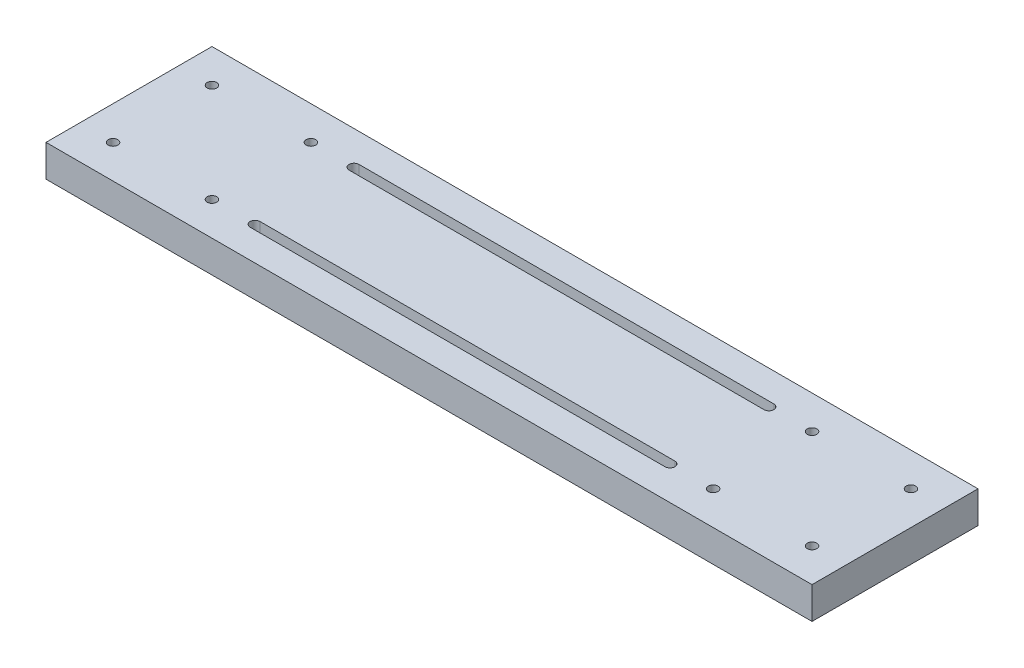
ISO-10303-21;
HEADER;
FILE_DESCRIPTION(('STEP AP214'),'2;1');
FILE_NAME('part.step','',(''),(''),'','','');
FILE_SCHEMA(('AUTOMOTIVE_DESIGN { 1 0 10303 214 1 1 1 1 }'));
ENDSEC;
DATA;
#1=APPLICATION_CONTEXT('core data for automotive mechanical design processes');
#2=APPLICATION_PROTOCOL_DEFINITION('international standard','automotive_design',2000,#1);
#3=PRODUCT_CONTEXT('',#1,'mechanical');
#4=PRODUCT('Part','Part','',(#3));
#5=PRODUCT_RELATED_PRODUCT_CATEGORY('part','',(#4));
#6=PRODUCT_DEFINITION_FORMATION('','',#4);
#7=PRODUCT_DEFINITION_CONTEXT('part definition',#1,'design');
#8=PRODUCT_DEFINITION('design','',#6,#7);
#9=PRODUCT_DEFINITION_SHAPE('','',#8);
#10=(LENGTH_UNIT() NAMED_UNIT(*) SI_UNIT(.MILLI.,.METRE.));
#11=(NAMED_UNIT(*) PLANE_ANGLE_UNIT() SI_UNIT($,.RADIAN.));
#12=(NAMED_UNIT(*) SI_UNIT($,.STERADIAN.) SOLID_ANGLE_UNIT());
#13=UNCERTAINTY_MEASURE_WITH_UNIT(LENGTH_MEASURE(1.E-05),#10,'distance_accuracy_value','');
#14=(GEOMETRIC_REPRESENTATION_CONTEXT(3) GLOBAL_UNCERTAINTY_ASSIGNED_CONTEXT((#13)) GLOBAL_UNIT_ASSIGNED_CONTEXT((#10,
#11,#12)) REPRESENTATION_CONTEXT('',''));
#15=CARTESIAN_POINT('',(0.,0.,0.));
#16=DIRECTION('',(0.,0.,1.));
#17=DIRECTION('',(1.,0.,0.));
#18=AXIS2_PLACEMENT_3D('',#15,#16,#17);
#19=CARTESIAN_POINT('',(-120.,10.,-26.));
#20=DIRECTION('',(1.,0.,0.));
#21=DIRECTION('',(0.,0.,-1.));
#22=AXIS2_PLACEMENT_3D('',#19,#20,#21);
#23=PLANE('',#22);
#24=DIRECTION('',(0.,0.,1.));
#25=VECTOR('',#24,1.);
#26=CARTESIAN_POINT('',(-120.,0.,-26.));
#27=LINE('',#26,#25);
#28=CARTESIAN_POINT('',(-120.,0.,-26.));
#29=VERTEX_POINT('',#28);
#30=CARTESIAN_POINT('',(-120.,0.,26.));
#31=VERTEX_POINT('',#30);
#32=EDGE_CURVE('E217',#29,#31,#27,.T.);
#33=ORIENTED_EDGE('',*,*,#32,.T.);
#34=DIRECTION('',(0.,-1.,0.));
#35=VECTOR('',#34,1.);
#36=CARTESIAN_POINT('',(-120.,10.,26.));
#37=LINE('',#36,#35);
#38=CARTESIAN_POINT('',(-120.,10.,26.));
#39=VERTEX_POINT('',#38);
#40=EDGE_CURVE('E11',#39,#31,#37,.T.);
#41=ORIENTED_EDGE('',*,*,#40,.F.);
#42=DIRECTION('',(0.,0.,1.));
#43=VECTOR('',#42,1.);
#44=CARTESIAN_POINT('',(-120.,10.,-26.));
#45=LINE('',#44,#43);
#46=CARTESIAN_POINT('',(-120.,10.,-26.));
#47=VERTEX_POINT('',#46);
#48=EDGE_CURVE('E218',#47,#39,#45,.T.);
#49=ORIENTED_EDGE('',*,*,#48,.F.);
#50=DIRECTION('',(0.,-1.,0.));
#51=VECTOR('',#50,1.);
#52=CARTESIAN_POINT('',(-120.,10.,-26.));
#53=LINE('',#52,#51);
#54=EDGE_CURVE('E228',#47,#29,#53,.T.);
#55=ORIENTED_EDGE('',*,*,#54,.T.);
#56=EDGE_LOOP('',(#33,#41,#49,#55));
#57=FACE_BOUND('',#56,.T.);
#58=ADVANCED_FACE('F36',(#57),#23,.F.);
#59=CARTESIAN_POINT('',(-120.,10.,26.));
#60=DIRECTION('',(0.,0.,-1.));
#61=DIRECTION('',(-1.,0.,0.));
#62=AXIS2_PLACEMENT_3D('',#59,#60,#61);
#63=PLANE('',#62);
#64=DIRECTION('',(1.,0.,0.));
#65=VECTOR('',#64,1.);
#66=CARTESIAN_POINT('',(-120.,0.,26.));
#67=LINE('',#66,#65);
#68=CARTESIAN_POINT('',(120.,0.,26.));
#69=VERTEX_POINT('',#68);
#70=EDGE_CURVE('E231',#31,#69,#67,.T.);
#71=ORIENTED_EDGE('',*,*,#70,.T.);
#72=DIRECTION('',(0.,-1.,0.));
#73=VECTOR('',#72,1.);
#74=CARTESIAN_POINT('',(120.,10.,26.));
#75=LINE('',#74,#73);
#76=CARTESIAN_POINT('',(120.,10.,26.));
#77=VERTEX_POINT('',#76);
#78=EDGE_CURVE('E43',#77,#69,#75,.T.);
#79=ORIENTED_EDGE('',*,*,#78,.F.);
#80=DIRECTION('',(1.,0.,0.));
#81=VECTOR('',#80,1.);
#82=CARTESIAN_POINT('',(-120.,10.,26.));
#83=LINE('',#82,#81);
#84=EDGE_CURVE('E221',#39,#77,#83,.T.);
#85=ORIENTED_EDGE('',*,*,#84,.F.);
#86=ORIENTED_EDGE('',*,*,#40,.T.);
#87=EDGE_LOOP('',(#71,#79,#85,#86));
#88=FACE_BOUND('',#87,.T.);
#89=ADVANCED_FACE('F260',(#88),#63,.F.);
#90=CARTESIAN_POINT('',(120.,10.,-26.));
#91=DIRECTION('',(-1.,0.,0.));
#92=DIRECTION('',(0.,0.,1.));
#93=AXIS2_PLACEMENT_3D('',#90,#91,#92);
#94=PLANE('',#93);
#95=DIRECTION('',(0.,0.,-1.));
#96=VECTOR('',#95,1.);
#97=CARTESIAN_POINT('',(120.,0.,-26.));
#98=LINE('',#97,#96);
#99=CARTESIAN_POINT('',(120.,0.,-26.));
#100=VERTEX_POINT('',#99);
#101=EDGE_CURVE('E233',#69,#100,#98,.T.);
#102=ORIENTED_EDGE('',*,*,#101,.T.);
#103=DIRECTION('',(0.,-1.,0.));
#104=VECTOR('',#103,1.);
#105=CARTESIAN_POINT('',(120.,10.,-26.));
#106=LINE('',#105,#104);
#107=CARTESIAN_POINT('',(120.,10.,-26.));
#108=VERTEX_POINT('',#107);
#109=EDGE_CURVE('E238',#108,#100,#106,.T.);
#110=ORIENTED_EDGE('',*,*,#109,.F.);
#111=DIRECTION('',(0.,0.,-1.));
#112=VECTOR('',#111,1.);
#113=CARTESIAN_POINT('',(120.,10.,-26.));
#114=LINE('',#113,#112);
#115=EDGE_CURVE('E224',#77,#108,#114,.T.);
#116=ORIENTED_EDGE('',*,*,#115,.F.);
#117=ORIENTED_EDGE('',*,*,#78,.T.);
#118=EDGE_LOOP('',(#102,#110,#116,#117));
#119=FACE_BOUND('',#118,.T.);
#120=ADVANCED_FACE('F245',(#119),#94,.F.);
#121=CARTESIAN_POINT('',(-120.,10.,-26.));
#122=DIRECTION('',(0.,0.,1.));
#123=DIRECTION('',(1.,0.,0.));
#124=AXIS2_PLACEMENT_3D('',#121,#122,#123);
#125=PLANE('',#124);
#126=DIRECTION('',(-1.,0.,0.));
#127=VECTOR('',#126,1.);
#128=CARTESIAN_POINT('',(-120.,0.,-26.));
#129=LINE('',#128,#127);
#130=EDGE_CURVE('E222',#100,#29,#129,.T.);
#131=ORIENTED_EDGE('',*,*,#130,.T.);
#132=ORIENTED_EDGE('',*,*,#54,.F.);
#133=DIRECTION('',(-1.,0.,0.));
#134=VECTOR('',#133,1.);
#135=CARTESIAN_POINT('',(-120.,10.,-26.));
#136=LINE('',#135,#134);
#137=EDGE_CURVE('E226',#108,#47,#136,.T.);
#138=ORIENTED_EDGE('',*,*,#137,.F.);
#139=ORIENTED_EDGE('',*,*,#109,.T.);
#140=EDGE_LOOP('',(#131,#132,#138,#139));
#141=FACE_BOUND('',#140,.T.);
#142=ADVANCED_FACE('F253',(#141),#125,.F.);
#143=CARTESIAN_POINT('',(0.,10.,0.));
#144=DIRECTION('',(0.,1.,0.));
#145=DIRECTION('',(0.,0.,1.));
#146=AXIS2_PLACEMENT_3D('',#143,#144,#145);
#147=PLANE('',#146);
#148=DIRECTION('',(1.,0.,0.));
#149=VECTOR('',#148,1.);
#150=CARTESIAN_POINT('',(-65.,10.,17.05));
#151=LINE('',#150,#149);
#152=CARTESIAN_POINT('',(-65.,10.,17.05));
#153=VERTEX_POINT('',#152);
#154=CARTESIAN_POINT('',(65.,10.,17.05));
#155=VERTEX_POINT('',#154);
#156=EDGE_CURVE('E154',#153,#155,#151,.T.);
#157=ORIENTED_EDGE('',*,*,#156,.F.);
#158=CARTESIAN_POINT('',(-65.,10.,15.5));
#159=DIRECTION('',(0.,1.,0.));
#160=DIRECTION('',(0.,0.,1.));
#161=AXIS2_PLACEMENT_3D('',#158,#159,#160);
#162=CIRCLE('',#161,1.55);
#163=CARTESIAN_POINT('',(-65.,10.,13.95));
#164=VERTEX_POINT('',#163);
#165=EDGE_CURVE('E152',#164,#153,#162,.T.);
#166=ORIENTED_EDGE('',*,*,#165,.F.);
#167=DIRECTION('',(1.,0.,0.));
#168=VECTOR('',#167,1.);
#169=CARTESIAN_POINT('',(-65.,10.,13.95));
#170=LINE('',#169,#168);
#171=CARTESIAN_POINT('',(65.,10.,13.95));
#172=VERTEX_POINT('',#171);
#173=EDGE_CURVE('E165',#164,#172,#170,.T.);
#174=ORIENTED_EDGE('',*,*,#173,.T.);
#175=CARTESIAN_POINT('',(65.,10.,15.5));
#176=DIRECTION('',(0.,1.,0.));
#177=DIRECTION('',(0.,0.,1.));
#178=AXIS2_PLACEMENT_3D('',#175,#176,#177);
#179=CIRCLE('',#178,1.55);
#180=EDGE_CURVE('E129',#155,#172,#179,.T.);
#181=ORIENTED_EDGE('',*,*,#180,.F.);
#182=EDGE_LOOP('',(#157,#166,#174,#181));
#183=FACE_BOUND('',#182,.T.);
#184=CARTESIAN_POINT('',(-78.5,10.,-15.5));
#185=DIRECTION('',(0.,1.,0.));
#186=DIRECTION('',(0.,0.,1.));
#187=AXIS2_PLACEMENT_3D('',#184,#185,#186);
#188=CIRCLE('',#187,1.5);
#189=CARTESIAN_POINT('',(-78.5,10.,-14.));
#190=VERTEX_POINT('',#189);
#191=EDGE_CURVE('E158',#190,#190,#188,.T.);
#192=ORIENTED_EDGE('',*,*,#191,.F.);
#193=EDGE_LOOP('',(#192));
#194=FACE_BOUND('',#193,.T.);
#195=CARTESIAN_POINT('',(-78.5,10.,15.5));
#196=DIRECTION('',(0.,1.,0.));
#197=DIRECTION('',(0.,0.,1.));
#198=AXIS2_PLACEMENT_3D('',#195,#196,#197);
#199=CIRCLE('',#198,1.5);
#200=CARTESIAN_POINT('',(-78.5,10.,17.));
#201=VERTEX_POINT('',#200);
#202=EDGE_CURVE('E350',#201,#201,#199,.T.);
#203=ORIENTED_EDGE('',*,*,#202,.F.);
#204=EDGE_LOOP('',(#203));
#205=FACE_BOUND('',#204,.T.);
#206=CARTESIAN_POINT('',(-109.5,10.,15.5));
#207=DIRECTION('',(0.,1.,0.));
#208=DIRECTION('',(0.,0.,1.));
#209=AXIS2_PLACEMENT_3D('',#206,#207,#208);
#210=CIRCLE('',#209,1.5);
#211=CARTESIAN_POINT('',(-109.5,10.,17.));
#212=VERTEX_POINT('',#211);
#213=EDGE_CURVE('E343',#212,#212,#210,.T.);
#214=ORIENTED_EDGE('',*,*,#213,.F.);
#215=EDGE_LOOP('',(#214));
#216=FACE_BOUND('',#215,.T.);
#217=CARTESIAN_POINT('',(109.5,10.,15.5));
#218=DIRECTION('',(0.,1.,0.));
#219=DIRECTION('',(0.,0.,1.));
#220=AXIS2_PLACEMENT_3D('',#217,#218,#219);
#221=CIRCLE('',#220,1.5);
#222=CARTESIAN_POINT('',(109.5,10.,17.));
#223=VERTEX_POINT('',#222);
#224=EDGE_CURVE('E200',#223,#223,#221,.T.);
#225=ORIENTED_EDGE('',*,*,#224,.F.);
#226=EDGE_LOOP('',(#225));
#227=FACE_BOUND('',#226,.T.);
#228=CARTESIAN_POINT('',(78.5,10.,-15.5));
#229=DIRECTION('',(0.,1.,0.));
#230=DIRECTION('',(0.,0.,1.));
#231=AXIS2_PLACEMENT_3D('',#228,#229,#230);
#232=CIRCLE('',#231,1.5);
#233=CARTESIAN_POINT('',(78.5,10.,-14.));
#234=VERTEX_POINT('',#233);
#235=EDGE_CURVE('E173',#234,#234,#232,.T.);
#236=ORIENTED_EDGE('',*,*,#235,.F.);
#237=EDGE_LOOP('',(#236));
#238=FACE_BOUND('',#237,.T.);
#239=CARTESIAN_POINT('',(78.5,10.,15.5));
#240=DIRECTION('',(0.,1.,0.));
#241=DIRECTION('',(0.,0.,1.));
#242=AXIS2_PLACEMENT_3D('',#239,#240,#241);
#243=CIRCLE('',#242,1.5);
#244=CARTESIAN_POINT('',(78.5,10.,17.));
#245=VERTEX_POINT('',#244);
#246=EDGE_CURVE('E166',#245,#245,#243,.T.);
#247=ORIENTED_EDGE('',*,*,#246,.F.);
#248=EDGE_LOOP('',(#247));
#249=FACE_BOUND('',#248,.T.);
#250=DIRECTION('',(1.,0.,0.));
#251=VECTOR('',#250,1.);
#252=CARTESIAN_POINT('',(-65.,10.,-13.95));
#253=LINE('',#252,#251);
#254=CARTESIAN_POINT('',(-65.,10.,-13.95));
#255=VERTEX_POINT('',#254);
#256=CARTESIAN_POINT('',(65.,10.,-13.95));
#257=VERTEX_POINT('',#256);
#258=EDGE_CURVE('E197',#255,#257,#253,.T.);
#259=ORIENTED_EDGE('',*,*,#258,.F.);
#260=CARTESIAN_POINT('',(-65.,10.,-15.5));
#261=DIRECTION('',(0.,1.,0.));
#262=DIRECTION('',(0.,0.,1.));
#263=AXIS2_PLACEMENT_3D('',#260,#261,#262);
#264=CIRCLE('',#263,1.55);
#265=CARTESIAN_POINT('',(-65.,10.,-17.05));
#266=VERTEX_POINT('',#265);
#267=EDGE_CURVE('E195',#266,#255,#264,.T.);
#268=ORIENTED_EDGE('',*,*,#267,.F.);
#269=DIRECTION('',(1.,0.,0.));
#270=VECTOR('',#269,1.);
#271=CARTESIAN_POINT('',(-65.,10.,-17.05));
#272=LINE('',#271,#270);
#273=CARTESIAN_POINT('',(65.,10.,-17.05));
#274=VERTEX_POINT('',#273);
#275=EDGE_CURVE('E157',#266,#274,#272,.T.);
#276=ORIENTED_EDGE('',*,*,#275,.T.);
#277=CARTESIAN_POINT('',(65.,10.,-15.5));
#278=DIRECTION('',(0.,1.,0.));
#279=DIRECTION('',(0.,0.,1.));
#280=AXIS2_PLACEMENT_3D('',#277,#278,#279);
#281=CIRCLE('',#280,1.55);
#282=EDGE_CURVE('E170',#257,#274,#281,.T.);
#283=ORIENTED_EDGE('',*,*,#282,.F.);
#284=EDGE_LOOP('',(#259,#268,#276,#283));
#285=FACE_BOUND('',#284,.T.);
#286=CARTESIAN_POINT('',(-109.5,10.,-15.5));
#287=DIRECTION('',(0.,1.,0.));
#288=DIRECTION('',(0.,0.,1.));
#289=AXIS2_PLACEMENT_3D('',#286,#287,#288);
#290=CIRCLE('',#289,1.5);
#291=CARTESIAN_POINT('',(-109.5,10.,-14.));
#292=VERTEX_POINT('',#291);
#293=EDGE_CURVE('E338',#292,#292,#290,.T.);
#294=ORIENTED_EDGE('',*,*,#293,.F.);
#295=EDGE_LOOP('',(#294));
#296=FACE_BOUND('',#295,.T.);
#297=CARTESIAN_POINT('',(109.5,10.,-15.5));
#298=DIRECTION('',(0.,1.,0.));
#299=DIRECTION('',(0.,0.,1.));
#300=AXIS2_PLACEMENT_3D('',#297,#298,#299);
#301=CIRCLE('',#300,1.5);
#302=CARTESIAN_POINT('',(109.5,10.,-14.));
#303=VERTEX_POINT('',#302);
#304=EDGE_CURVE('E214',#303,#303,#301,.T.);
#305=ORIENTED_EDGE('',*,*,#304,.F.);
#306=EDGE_LOOP('',(#305));
#307=FACE_BOUND('',#306,.T.);
#308=ORIENTED_EDGE('',*,*,#48,.T.);
#309=ORIENTED_EDGE('',*,*,#84,.T.);
#310=ORIENTED_EDGE('',*,*,#115,.T.);
#311=ORIENTED_EDGE('',*,*,#137,.T.);
#312=EDGE_LOOP('',(#308,#309,#310,#311));
#313=FACE_BOUND('',#312,.T.);
#314=ADVANCED_FACE('F259',(#183,#194,#205,#216,#227,#238,#249,#285,#296,#307,#313),#147,.T.);
#315=CARTESIAN_POINT('',(0.,0.,0.));
#316=DIRECTION('',(0.,1.,0.));
#317=DIRECTION('',(0.,0.,1.));
#318=AXIS2_PLACEMENT_3D('',#315,#316,#317);
#319=PLANE('',#318);
#320=CARTESIAN_POINT('',(-65.,0.,15.5));
#321=DIRECTION('',(0.,1.,0.));
#322=DIRECTION('',(0.,0.,1.));
#323=AXIS2_PLACEMENT_3D('',#320,#321,#322);
#324=CIRCLE('',#323,1.55);
#325=CARTESIAN_POINT('',(-65.,0.,13.95));
#326=VERTEX_POINT('',#325);
#327=CARTESIAN_POINT('',(-65.,0.,17.05));
#328=VERTEX_POINT('',#327);
#329=EDGE_CURVE('E147',#326,#328,#324,.T.);
#330=ORIENTED_EDGE('',*,*,#329,.T.);
#331=DIRECTION('',(1.,0.,0.));
#332=VECTOR('',#331,1.);
#333=CARTESIAN_POINT('',(-65.,0.,17.05));
#334=LINE('',#333,#332);
#335=CARTESIAN_POINT('',(65.,0.,17.05));
#336=VERTEX_POINT('',#335);
#337=EDGE_CURVE('E145',#328,#336,#334,.T.);
#338=ORIENTED_EDGE('',*,*,#337,.T.);
#339=CARTESIAN_POINT('',(65.,0.,15.5));
#340=DIRECTION('',(0.,1.,0.));
#341=DIRECTION('',(0.,0.,1.));
#342=AXIS2_PLACEMENT_3D('',#339,#340,#341);
#343=CIRCLE('',#342,1.55);
#344=CARTESIAN_POINT('',(65.,0.,13.95));
#345=VERTEX_POINT('',#344);
#346=EDGE_CURVE('E126',#336,#345,#343,.T.);
#347=ORIENTED_EDGE('',*,*,#346,.T.);
#348=DIRECTION('',(1.,0.,0.));
#349=VECTOR('',#348,1.);
#350=CARTESIAN_POINT('',(-65.,0.,13.95));
#351=LINE('',#350,#349);
#352=EDGE_CURVE('E136',#326,#345,#351,.T.);
#353=ORIENTED_EDGE('',*,*,#352,.F.);
#354=EDGE_LOOP('',(#330,#338,#347,#353));
#355=FACE_BOUND('',#354,.T.);
#356=CARTESIAN_POINT('',(-78.5,0.,-15.5));
#357=DIRECTION('',(0.,1.,0.));
#358=DIRECTION('',(0.,0.,1.));
#359=AXIS2_PLACEMENT_3D('',#356,#357,#358);
#360=CIRCLE('',#359,1.5);
#361=CARTESIAN_POINT('',(-78.5,0.,-14.));
#362=VERTEX_POINT('',#361);
#363=EDGE_CURVE('E161',#362,#362,#360,.T.);
#364=ORIENTED_EDGE('',*,*,#363,.T.);
#365=EDGE_LOOP('',(#364));
#366=FACE_BOUND('',#365,.T.);
#367=CARTESIAN_POINT('',(-78.5,0.,15.5));
#368=DIRECTION('',(0.,1.,0.));
#369=DIRECTION('',(0.,0.,1.));
#370=AXIS2_PLACEMENT_3D('',#367,#368,#369);
#371=CIRCLE('',#370,1.5);
#372=CARTESIAN_POINT('',(-78.5,0.,17.));
#373=VERTEX_POINT('',#372);
#374=EDGE_CURVE('E162',#373,#373,#371,.T.);
#375=ORIENTED_EDGE('',*,*,#374,.T.);
#376=EDGE_LOOP('',(#375));
#377=FACE_BOUND('',#376,.T.);
#378=CARTESIAN_POINT('',(-109.5,0.,15.5));
#379=DIRECTION('',(0.,1.,0.));
#380=DIRECTION('',(0.,0.,1.));
#381=AXIS2_PLACEMENT_3D('',#378,#379,#380);
#382=CIRCLE('',#381,1.5);
#383=CARTESIAN_POINT('',(-109.5,0.,17.));
#384=VERTEX_POINT('',#383);
#385=EDGE_CURVE('E346',#384,#384,#382,.T.);
#386=ORIENTED_EDGE('',*,*,#385,.T.);
#387=EDGE_LOOP('',(#386));
#388=FACE_BOUND('',#387,.T.);
#389=CARTESIAN_POINT('',(109.5,0.,15.5));
#390=DIRECTION('',(0.,1.,0.));
#391=DIRECTION('',(0.,0.,1.));
#392=AXIS2_PLACEMENT_3D('',#389,#390,#391);
#393=CIRCLE('',#392,1.5);
#394=CARTESIAN_POINT('',(109.5,0.,17.));
#395=VERTEX_POINT('',#394);
#396=EDGE_CURVE('E203',#395,#395,#393,.T.);
#397=ORIENTED_EDGE('',*,*,#396,.T.);
#398=EDGE_LOOP('',(#397));
#399=FACE_BOUND('',#398,.T.);
#400=CARTESIAN_POINT('',(78.5,0.,-15.5));
#401=DIRECTION('',(0.,1.,0.));
#402=DIRECTION('',(0.,0.,1.));
#403=AXIS2_PLACEMENT_3D('',#400,#401,#402);
#404=CIRCLE('',#403,1.5);
#405=CARTESIAN_POINT('',(78.5,0.,-14.));
#406=VERTEX_POINT('',#405);
#407=EDGE_CURVE('E204',#406,#406,#404,.T.);
#408=ORIENTED_EDGE('',*,*,#407,.T.);
#409=EDGE_LOOP('',(#408));
#410=FACE_BOUND('',#409,.T.);
#411=CARTESIAN_POINT('',(78.5,0.,15.5));
#412=DIRECTION('',(0.,1.,0.));
#413=DIRECTION('',(0.,0.,1.));
#414=AXIS2_PLACEMENT_3D('',#411,#412,#413);
#415=CIRCLE('',#414,1.5);
#416=CARTESIAN_POINT('',(78.5,0.,17.));
#417=VERTEX_POINT('',#416);
#418=EDGE_CURVE('E169',#417,#417,#415,.T.);
#419=ORIENTED_EDGE('',*,*,#418,.T.);
#420=EDGE_LOOP('',(#419));
#421=FACE_BOUND('',#420,.T.);
#422=CARTESIAN_POINT('',(-65.,0.,-15.5));
#423=DIRECTION('',(0.,1.,0.));
#424=DIRECTION('',(0.,0.,1.));
#425=AXIS2_PLACEMENT_3D('',#422,#423,#424);
#426=CIRCLE('',#425,1.55);
#427=CARTESIAN_POINT('',(-65.,0.,-17.05));
#428=VERTEX_POINT('',#427);
#429=CARTESIAN_POINT('',(-65.,0.,-13.95));
#430=VERTEX_POINT('',#429);
#431=EDGE_CURVE('E192',#428,#430,#426,.T.);
#432=ORIENTED_EDGE('',*,*,#431,.T.);
#433=DIRECTION('',(1.,0.,0.));
#434=VECTOR('',#433,1.);
#435=CARTESIAN_POINT('',(-65.,0.,-13.95));
#436=LINE('',#435,#434);
#437=CARTESIAN_POINT('',(65.,0.,-13.95));
#438=VERTEX_POINT('',#437);
#439=EDGE_CURVE('E189',#430,#438,#436,.T.);
#440=ORIENTED_EDGE('',*,*,#439,.T.);
#441=CARTESIAN_POINT('',(65.,0.,-15.5));
#442=DIRECTION('',(0.,1.,0.));
#443=DIRECTION('',(0.,0.,1.));
#444=AXIS2_PLACEMENT_3D('',#441,#442,#443);
#445=CIRCLE('',#444,1.55);
#446=CARTESIAN_POINT('',(65.,0.,-17.05));
#447=VERTEX_POINT('',#446);
#448=EDGE_CURVE('E186',#438,#447,#445,.T.);
#449=ORIENTED_EDGE('',*,*,#448,.T.);
#450=DIRECTION('',(1.,0.,0.));
#451=VECTOR('',#450,1.);
#452=CARTESIAN_POINT('',(-65.,0.,-17.05));
#453=LINE('',#452,#451);
#454=EDGE_CURVE('E184',#428,#447,#453,.T.);
#455=ORIENTED_EDGE('',*,*,#454,.F.);
#456=EDGE_LOOP('',(#432,#440,#449,#455));
#457=FACE_BOUND('',#456,.T.);
#458=CARTESIAN_POINT('',(-109.5,0.,-15.5));
#459=DIRECTION('',(0.,1.,0.));
#460=DIRECTION('',(0.,0.,1.));
#461=AXIS2_PLACEMENT_3D('',#458,#459,#460);
#462=CIRCLE('',#461,1.5);
#463=CARTESIAN_POINT('',(-109.5,0.,-14.));
#464=VERTEX_POINT('',#463);
#465=EDGE_CURVE('E341',#464,#464,#462,.T.);
#466=ORIENTED_EDGE('',*,*,#465,.T.);
#467=EDGE_LOOP('',(#466));
#468=FACE_BOUND('',#467,.T.);
#469=CARTESIAN_POINT('',(109.5,0.,-15.5));
#470=DIRECTION('',(0.,1.,0.));
#471=DIRECTION('',(0.,0.,1.));
#472=AXIS2_PLACEMENT_3D('',#469,#470,#471);
#473=CIRCLE('',#472,1.5);
#474=CARTESIAN_POINT('',(109.5,0.,-14.));
#475=VERTEX_POINT('',#474);
#476=EDGE_CURVE('E207',#475,#475,#473,.T.);
#477=ORIENTED_EDGE('',*,*,#476,.T.);
#478=EDGE_LOOP('',(#477));
#479=FACE_BOUND('',#478,.T.);
#480=ORIENTED_EDGE('',*,*,#32,.F.);
#481=ORIENTED_EDGE('',*,*,#130,.F.);
#482=ORIENTED_EDGE('',*,*,#101,.F.);
#483=ORIENTED_EDGE('',*,*,#70,.F.);
#484=EDGE_LOOP('',(#480,#481,#482,#483));
#485=FACE_BOUND('',#484,.T.);
#486=ADVANCED_FACE('F142',(#355,#366,#377,#388,#399,#410,#421,#457,#468,#479,#485),#319,.F.);
#487=CARTESIAN_POINT('',(109.5,10.001,-15.5));
#488=DIRECTION('',(0.,-1.,0.));
#489=DIRECTION('',(0.,0.,-1.));
#490=AXIS2_PLACEMENT_3D('',#487,#488,#489);
#491=CYLINDRICAL_SURFACE('',#490,1.5);
#492=ORIENTED_EDGE('',*,*,#304,.T.);
#493=EDGE_LOOP('',(#492));
#494=FACE_BOUND('',#493,.T.);
#495=ORIENTED_EDGE('',*,*,#476,.F.);
#496=EDGE_LOOP('',(#495));
#497=FACE_BOUND('',#496,.T.);
#498=ADVANCED_FACE('F272',(#494,#497),#491,.F.);
#499=CARTESIAN_POINT('',(-109.5,10.001,-15.5));
#500=DIRECTION('',(0.,-1.,0.));
#501=DIRECTION('',(0.,0.,-1.));
#502=AXIS2_PLACEMENT_3D('',#499,#500,#501);
#503=CYLINDRICAL_SURFACE('',#502,1.5);
#504=ORIENTED_EDGE('',*,*,#293,.T.);
#505=EDGE_LOOP('',(#504));
#506=FACE_BOUND('',#505,.T.);
#507=ORIENTED_EDGE('',*,*,#465,.F.);
#508=EDGE_LOOP('',(#507));
#509=FACE_BOUND('',#508,.T.);
#510=ADVANCED_FACE('F278',(#506,#509),#503,.F.);
#511=CARTESIAN_POINT('',(-65.,10.001,-15.5));
#512=DIRECTION('',(0.,-1.,0.));
#513=DIRECTION('',(0.,0.,-1.));
#514=AXIS2_PLACEMENT_3D('',#511,#512,#513);
#515=CYLINDRICAL_SURFACE('',#514,1.55);
#516=ORIENTED_EDGE('',*,*,#267,.T.);
#517=DIRECTION('',(0.,-1.,0.));
#518=VECTOR('',#517,1.);
#519=CARTESIAN_POINT('',(-65.,10.001,-13.95));
#520=LINE('',#519,#518);
#521=EDGE_CURVE('E176',#255,#430,#520,.T.);
#522=ORIENTED_EDGE('',*,*,#521,.T.);
#523=ORIENTED_EDGE('',*,*,#431,.F.);
#524=DIRECTION('',(0.,-1.,0.));
#525=VECTOR('',#524,1.);
#526=CARTESIAN_POINT('',(-65.,10.001,-17.05));
#527=LINE('',#526,#525);
#528=EDGE_CURVE('E181',#266,#428,#527,.T.);
#529=ORIENTED_EDGE('',*,*,#528,.F.);
#530=EDGE_LOOP('',(#516,#522,#523,#529));
#531=FACE_BOUND('',#530,.T.);
#532=ADVANCED_FACE('F300',(#531),#515,.F.);
#533=CARTESIAN_POINT('',(-65.,10.001,-13.95));
#534=DIRECTION('',(0.,0.,-1.));
#535=DIRECTION('',(-1.,0.,0.));
#536=AXIS2_PLACEMENT_3D('',#533,#534,#535);
#537=PLANE('',#536);
#538=ORIENTED_EDGE('',*,*,#258,.T.);
#539=DIRECTION('',(0.,-1.,0.));
#540=VECTOR('',#539,1.);
#541=CARTESIAN_POINT('',(65.,10.001,-13.95));
#542=LINE('',#541,#540);
#543=EDGE_CURVE('E178',#257,#438,#542,.T.);
#544=ORIENTED_EDGE('',*,*,#543,.T.);
#545=ORIENTED_EDGE('',*,*,#439,.F.);
#546=ORIENTED_EDGE('',*,*,#521,.F.);
#547=EDGE_LOOP('',(#538,#544,#545,#546));
#548=FACE_BOUND('',#547,.T.);
#549=ADVANCED_FACE('F296',(#548),#537,.T.);
#550=CARTESIAN_POINT('',(65.,10.001,-15.5));
#551=DIRECTION('',(0.,-1.,0.));
#552=DIRECTION('',(0.,0.,-1.));
#553=AXIS2_PLACEMENT_3D('',#550,#551,#552);
#554=CYLINDRICAL_SURFACE('',#553,1.55);
#555=ORIENTED_EDGE('',*,*,#282,.T.);
#556=DIRECTION('',(0.,-1.,0.));
#557=VECTOR('',#556,1.);
#558=CARTESIAN_POINT('',(65.,10.001,-17.05));
#559=LINE('',#558,#557);
#560=EDGE_CURVE('E58',#274,#447,#559,.T.);
#561=ORIENTED_EDGE('',*,*,#560,.T.);
#562=ORIENTED_EDGE('',*,*,#448,.F.);
#563=ORIENTED_EDGE('',*,*,#543,.F.);
#564=EDGE_LOOP('',(#555,#561,#562,#563));
#565=FACE_BOUND('',#564,.T.);
#566=ADVANCED_FACE('F293',(#565),#554,.F.);
#567=CARTESIAN_POINT('',(-65.,10.001,-17.05));
#568=DIRECTION('',(0.,0.,-1.));
#569=DIRECTION('',(-1.,0.,0.));
#570=AXIS2_PLACEMENT_3D('',#567,#568,#569);
#571=PLANE('',#570);
#572=ORIENTED_EDGE('',*,*,#528,.T.);
#573=ORIENTED_EDGE('',*,*,#454,.T.);
#574=ORIENTED_EDGE('',*,*,#560,.F.);
#575=ORIENTED_EDGE('',*,*,#275,.F.);
#576=EDGE_LOOP('',(#572,#573,#574,#575));
#577=FACE_BOUND('',#576,.T.);
#578=ADVANCED_FACE('F290',(#577),#571,.F.);
#579=CARTESIAN_POINT('',(78.5,10.001,15.5));
#580=DIRECTION('',(0.,-1.,0.));
#581=DIRECTION('',(0.,0.,-1.));
#582=AXIS2_PLACEMENT_3D('',#579,#580,#581);
#583=CYLINDRICAL_SURFACE('',#582,1.5);
#584=ORIENTED_EDGE('',*,*,#246,.T.);
#585=EDGE_LOOP('',(#584));
#586=FACE_BOUND('',#585,.T.);
#587=ORIENTED_EDGE('',*,*,#418,.F.);
#588=EDGE_LOOP('',(#587));
#589=FACE_BOUND('',#588,.T.);
#590=ADVANCED_FACE('F284',(#586,#589),#583,.F.);
#591=CARTESIAN_POINT('',(78.5,10.001,-15.5));
#592=DIRECTION('',(0.,-1.,0.));
#593=DIRECTION('',(0.,0.,-1.));
#594=AXIS2_PLACEMENT_3D('',#591,#592,#593);
#595=CYLINDRICAL_SURFACE('',#594,1.5);
#596=ORIENTED_EDGE('',*,*,#235,.T.);
#597=EDGE_LOOP('',(#596));
#598=FACE_BOUND('',#597,.T.);
#599=ORIENTED_EDGE('',*,*,#407,.F.);
#600=EDGE_LOOP('',(#599));
#601=FACE_BOUND('',#600,.T.);
#602=ADVANCED_FACE('F280',(#598,#601),#595,.F.);
#603=CARTESIAN_POINT('',(109.5,10.001,15.5));
#604=DIRECTION('',(0.,-1.,0.));
#605=DIRECTION('',(0.,0.,-1.));
#606=AXIS2_PLACEMENT_3D('',#603,#604,#605);
#607=CYLINDRICAL_SURFACE('',#606,1.5);
#608=ORIENTED_EDGE('',*,*,#224,.T.);
#609=EDGE_LOOP('',(#608));
#610=FACE_BOUND('',#609,.T.);
#611=ORIENTED_EDGE('',*,*,#396,.F.);
#612=EDGE_LOOP('',(#611));
#613=FACE_BOUND('',#612,.T.);
#614=ADVANCED_FACE('F283',(#610,#613),#607,.F.);
#615=CARTESIAN_POINT('',(-109.5,10.001,15.5));
#616=DIRECTION('',(0.,-1.,0.));
#617=DIRECTION('',(0.,0.,-1.));
#618=AXIS2_PLACEMENT_3D('',#615,#616,#617);
#619=CYLINDRICAL_SURFACE('',#618,1.5);
#620=ORIENTED_EDGE('',*,*,#213,.T.);
#621=EDGE_LOOP('',(#620));
#622=FACE_BOUND('',#621,.T.);
#623=ORIENTED_EDGE('',*,*,#385,.F.);
#624=EDGE_LOOP('',(#623));
#625=FACE_BOUND('',#624,.T.);
#626=ADVANCED_FACE('F288',(#622,#625),#619,.F.);
#627=CARTESIAN_POINT('',(-78.5,10.001,15.5));
#628=DIRECTION('',(0.,-1.,0.));
#629=DIRECTION('',(0.,0.,-1.));
#630=AXIS2_PLACEMENT_3D('',#627,#628,#629);
#631=CYLINDRICAL_SURFACE('',#630,1.5);
#632=ORIENTED_EDGE('',*,*,#202,.T.);
#633=EDGE_LOOP('',(#632));
#634=FACE_BOUND('',#633,.T.);
#635=ORIENTED_EDGE('',*,*,#374,.F.);
#636=EDGE_LOOP('',(#635));
#637=FACE_BOUND('',#636,.T.);
#638=ADVANCED_FACE('F312',(#634,#637),#631,.F.);
#639=CARTESIAN_POINT('',(-78.5,10.001,-15.5));
#640=DIRECTION('',(0.,-1.,0.));
#641=DIRECTION('',(0.,0.,-1.));
#642=AXIS2_PLACEMENT_3D('',#639,#640,#641);
#643=CYLINDRICAL_SURFACE('',#642,1.5);
#644=ORIENTED_EDGE('',*,*,#191,.T.);
#645=EDGE_LOOP('',(#644));
#646=FACE_BOUND('',#645,.T.);
#647=ORIENTED_EDGE('',*,*,#363,.F.);
#648=EDGE_LOOP('',(#647));
#649=FACE_BOUND('',#648,.T.);
#650=ADVANCED_FACE('F308',(#646,#649),#643,.F.);
#651=CARTESIAN_POINT('',(-65.,10.001,15.5));
#652=DIRECTION('',(0.,-1.,0.));
#653=DIRECTION('',(0.,0.,-1.));
#654=AXIS2_PLACEMENT_3D('',#651,#652,#653);
#655=CYLINDRICAL_SURFACE('',#654,1.55);
#656=ORIENTED_EDGE('',*,*,#165,.T.);
#657=DIRECTION('',(0.,-1.,0.));
#658=VECTOR('',#657,1.);
#659=CARTESIAN_POINT('',(-65.,10.001,17.05));
#660=LINE('',#659,#658);
#661=EDGE_CURVE('E358',#153,#328,#660,.T.);
#662=ORIENTED_EDGE('',*,*,#661,.T.);
#663=ORIENTED_EDGE('',*,*,#329,.F.);
#664=DIRECTION('',(0.,-1.,0.));
#665=VECTOR('',#664,1.);
#666=CARTESIAN_POINT('',(-65.,10.001,13.95));
#667=LINE('',#666,#665);
#668=EDGE_CURVE('E131',#164,#326,#667,.T.);
#669=ORIENTED_EDGE('',*,*,#668,.F.);
#670=EDGE_LOOP('',(#656,#662,#663,#669));
#671=FACE_BOUND('',#670,.T.);
#672=ADVANCED_FACE('F311',(#671),#655,.F.);
#673=CARTESIAN_POINT('',(-65.,10.001,17.05));
#674=DIRECTION('',(0.,0.,-1.));
#675=DIRECTION('',(-1.,0.,0.));
#676=AXIS2_PLACEMENT_3D('',#673,#674,#675);
#677=PLANE('',#676);
#678=ORIENTED_EDGE('',*,*,#156,.T.);
#679=DIRECTION('',(0.,-1.,0.));
#680=VECTOR('',#679,1.);
#681=CARTESIAN_POINT('',(65.,10.001,17.05));
#682=LINE('',#681,#680);
#683=EDGE_CURVE('E132',#155,#336,#682,.T.);
#684=ORIENTED_EDGE('',*,*,#683,.T.);
#685=ORIENTED_EDGE('',*,*,#337,.F.);
#686=ORIENTED_EDGE('',*,*,#661,.F.);
#687=EDGE_LOOP('',(#678,#684,#685,#686));
#688=FACE_BOUND('',#687,.T.);
#689=ADVANCED_FACE('F318',(#688),#677,.T.);
#690=CARTESIAN_POINT('',(65.,10.001,15.5));
#691=DIRECTION('',(0.,-1.,0.));
#692=DIRECTION('',(0.,0.,-1.));
#693=AXIS2_PLACEMENT_3D('',#690,#691,#692);
#694=CYLINDRICAL_SURFACE('',#693,1.55);
#695=ORIENTED_EDGE('',*,*,#180,.T.);
#696=DIRECTION('',(0.,-1.,0.));
#697=VECTOR('',#696,1.);
#698=CARTESIAN_POINT('',(65.,10.001,13.95));
#699=LINE('',#698,#697);
#700=EDGE_CURVE('E50',#172,#345,#699,.T.);
#701=ORIENTED_EDGE('',*,*,#700,.T.);
#702=ORIENTED_EDGE('',*,*,#346,.F.);
#703=ORIENTED_EDGE('',*,*,#683,.F.);
#704=EDGE_LOOP('',(#695,#701,#702,#703));
#705=FACE_BOUND('',#704,.T.);
#706=ADVANCED_FACE('F123',(#705),#694,.F.);
#707=CARTESIAN_POINT('',(-65.,10.001,13.95));
#708=DIRECTION('',(0.,0.,-1.));
#709=DIRECTION('',(-1.,0.,0.));
#710=AXIS2_PLACEMENT_3D('',#707,#708,#709);
#711=PLANE('',#710);
#712=ORIENTED_EDGE('',*,*,#668,.T.);
#713=ORIENTED_EDGE('',*,*,#352,.T.);
#714=ORIENTED_EDGE('',*,*,#700,.F.);
#715=ORIENTED_EDGE('',*,*,#173,.F.);
#716=EDGE_LOOP('',(#712,#713,#714,#715));
#717=FACE_BOUND('',#716,.T.);
#718=ADVANCED_FACE('F137',(#717),#711,.F.);
#719=CLOSED_SHELL('',(#58,#89,#120,#142,#314,#486,#498,#510,#532,#549,#566,#578,#590,#602,#614,
#626,#638,#650,#672,#689,#706,#718));
#720=MANIFOLD_SOLID_BREP('B2',#719);
#721=ADVANCED_BREP_SHAPE_REPRESENTATION('',(#18,#720),#14);
#722=SHAPE_DEFINITION_REPRESENTATION(#9,#721);
ENDSEC;
END-ISO-10303-21;
